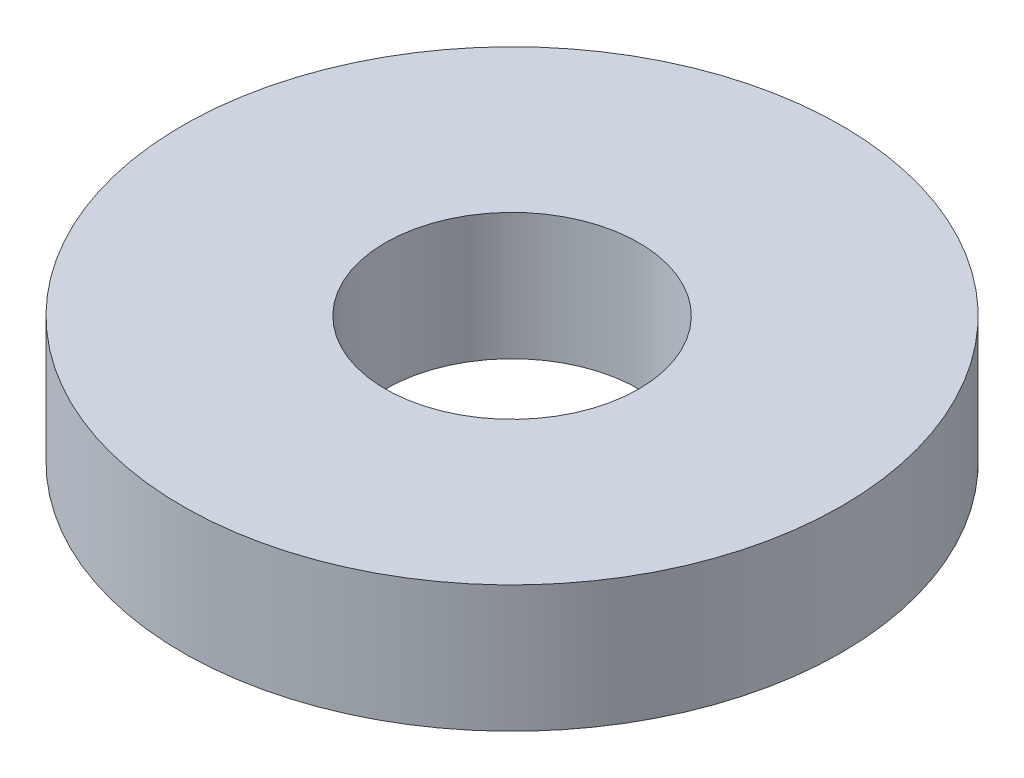
ISO-10303-21;
HEADER;
FILE_DESCRIPTION(('STEP AP214'),'2;1');
FILE_NAME('part.step','',(''),(''),'','','');
FILE_SCHEMA(('AUTOMOTIVE_DESIGN { 1 0 10303 214 1 1 1 1 }'));
ENDSEC;
DATA;
#1=APPLICATION_CONTEXT('core data for automotive mechanical design processes');
#2=APPLICATION_PROTOCOL_DEFINITION('international standard','automotive_design',2000,#1);
#3=PRODUCT_CONTEXT('',#1,'mechanical');
#4=PRODUCT('Part','Part','',(#3));
#5=PRODUCT_RELATED_PRODUCT_CATEGORY('part','',(#4));
#6=PRODUCT_DEFINITION_FORMATION('','',#4);
#7=PRODUCT_DEFINITION_CONTEXT('part definition',#1,'design');
#8=PRODUCT_DEFINITION('design','',#6,#7);
#9=PRODUCT_DEFINITION_SHAPE('','',#8);
#10=(LENGTH_UNIT() NAMED_UNIT(*) SI_UNIT(.MILLI.,.METRE.));
#11=(NAMED_UNIT(*) PLANE_ANGLE_UNIT() SI_UNIT($,.RADIAN.));
#12=(NAMED_UNIT(*) SI_UNIT($,.STERADIAN.) SOLID_ANGLE_UNIT());
#13=UNCERTAINTY_MEASURE_WITH_UNIT(LENGTH_MEASURE(1.E-05),#10,'distance_accuracy_value','');
#14=(GEOMETRIC_REPRESENTATION_CONTEXT(3) GLOBAL_UNCERTAINTY_ASSIGNED_CONTEXT((#13)) GLOBAL_UNIT_ASSIGNED_CONTEXT((#10,
#11,#12)) REPRESENTATION_CONTEXT('',''));
#15=CARTESIAN_POINT('',(0.,0.,0.));
#16=DIRECTION('',(0.,0.,1.));
#17=DIRECTION('',(1.,0.,0.));
#18=AXIS2_PLACEMENT_3D('',#15,#16,#17);
#19=CARTESIAN_POINT('',(1.29916963098693E-11,143.832558139535,-9.99599455596024E-13));
#20=DIRECTION('',(0.,1.,0.));
#21=DIRECTION('',(0.994899822224884,0.,0.100867951981266));
#22=AXIS2_PLACEMENT_3D('',#19,#20,#21);
#23=CYLINDRICAL_SURFACE('',#22,6.3);
#24=CARTESIAN_POINT('',(1.29916963098693E-11,142.582558139535,-9.99599455596024E-13));
#25=DIRECTION('',(0.,1.,0.));
#26=DIRECTION('',(0.994899822224884,0.,0.100867951981266));
#27=AXIS2_PLACEMENT_3D('',#24,#25,#26);
#28=CIRCLE('',#27,6.3);
#29=CARTESIAN_POINT('',(-6.26786888000377,142.582558139535,-0.635468097482974));
#30=VERTEX_POINT('',#29);
#31=EDGE_CURVE('E56',#30,#30,#28,.T.);
#32=ORIENTED_EDGE('',*,*,#31,.F.);
#33=DIRECTION('',(0.,1.,0.));
#34=VECTOR('',#33,1.);
#35=CARTESIAN_POINT('',(-6.26786888000377,143.832558139535,-0.635468097482974));
#36=LINE('',#35,#34);
#37=CARTESIAN_POINT('',(-6.26786888000377,144.882558139535,-0.635468097482976));
#38=VERTEX_POINT('',#37);
#39=EDGE_CURVE('E11',#30,#38,#36,.T.);
#40=ORIENTED_EDGE('',*,*,#39,.T.);
#41=CARTESIAN_POINT('',(1.29916963098693E-11,144.882558139535,-9.99599455596024E-13));
#42=DIRECTION('',(0.,1.,0.));
#43=DIRECTION('',(0.994899822224884,0.,0.100867951981266));
#44=AXIS2_PLACEMENT_3D('',#41,#42,#43);
#45=CIRCLE('',#44,6.3);
#46=EDGE_CURVE('E48',#38,#38,#45,.T.);
#47=ORIENTED_EDGE('',*,*,#46,.T.);
#48=ORIENTED_EDGE('',*,*,#39,.F.);
#49=EDGE_LOOP('',(#32,#40,#47,#48));
#50=FACE_BOUND('',#49,.T.);
#51=ADVANCED_FACE('F38',(#50),#23,.F.);
#52=CARTESIAN_POINT('',(2.4872495555752,144.882558139535,0.252169879952165));
#53=DIRECTION('',(0.,1.,0.));
#54=DIRECTION('',(-0.994899822224884,0.,-0.100867951981266));
#55=AXIS2_PLACEMENT_3D('',#52,#53,#54);
#56=PLANE('',#55);
#57=ORIENTED_EDGE('',*,*,#46,.F.);
#58=EDGE_LOOP('',(#57));
#59=FACE_BOUND('',#58,.T.);
#60=CARTESIAN_POINT('',(1.29916963098693E-11,144.882558139535,-9.99599455596024E-13));
#61=DIRECTION('',(0.,1.,0.));
#62=DIRECTION('',(0.994899822224884,0.,0.100867951981266));
#63=AXIS2_PLACEMENT_3D('',#60,#61,#62);
#64=CIRCLE('',#63,2.7);
#65=CARTESIAN_POINT('',(-2.68622951999419,144.882558139535,-0.272343470350418));
#66=VERTEX_POINT('',#65);
#67=EDGE_CURVE('E96',#66,#66,#64,.T.);
#68=ORIENTED_EDGE('',*,*,#67,.T.);
#69=EDGE_LOOP('',(#68));
#70=FACE_BOUND('',#69,.T.);
#71=ADVANCED_FACE('F40',(#59,#70),#56,.F.);
#72=CARTESIAN_POINT('',(1.29916963098693E-11,143.832558139535,-9.99599455596024E-13));
#73=DIRECTION('',(0.,1.,0.));
#74=DIRECTION('',(0.994899822224884,0.,0.100867951981266));
#75=AXIS2_PLACEMENT_3D('',#72,#73,#74);
#76=CYLINDRICAL_SURFACE('',#75,2.7);
#77=CARTESIAN_POINT('',(1.29916963098693E-11,142.582558139535,-9.99599455596024E-13));
#78=DIRECTION('',(0.,-1.,0.));
#79=DIRECTION('',(0.994899822224884,0.,0.100867951981266));
#80=AXIS2_PLACEMENT_3D('',#77,#78,#79);
#81=CIRCLE('',#80,2.7);
#82=CARTESIAN_POINT('',(-2.68622951999419,142.582558139535,-0.272343470350418));
#83=VERTEX_POINT('',#82);
#84=EDGE_CURVE('E77',#83,#83,#81,.T.);
#85=ORIENTED_EDGE('',*,*,#84,.F.);
#86=DIRECTION('',(0.,1.,0.));
#87=VECTOR('',#86,1.);
#88=CARTESIAN_POINT('',(-2.68622951999419,143.832558139535,-0.272343470350417));
#89=LINE('',#88,#87);
#90=EDGE_CURVE('E42',#83,#66,#89,.T.);
#91=ORIENTED_EDGE('',*,*,#90,.T.);
#92=ORIENTED_EDGE('',*,*,#67,.F.);
#93=ORIENTED_EDGE('',*,*,#90,.F.);
#94=EDGE_LOOP('',(#85,#91,#92,#93));
#95=FACE_BOUND('',#94,.T.);
#96=ADVANCED_FACE('F101',(#95),#76,.T.);
#97=CARTESIAN_POINT('',(6.46684884447474,142.582558139535,0.655641687877229));
#98=DIRECTION('',(0.,-1.,0.));
#99=DIRECTION('',(-0.100867951981266,0.,0.994899822224884));
#100=AXIS2_PLACEMENT_3D('',#97,#98,#99);
#101=PLANE('',#100);
#102=ORIENTED_EDGE('',*,*,#84,.T.);
#103=EDGE_LOOP('',(#102));
#104=FACE_BOUND('',#103,.T.);
#105=CARTESIAN_POINT('',(1.29916963098693E-11,142.582558139535,-9.99599455596024E-13));
#106=DIRECTION('',(0.,1.,0.));
#107=DIRECTION('',(-0.994899822224884,0.,-0.100867951981266));
#108=AXIS2_PLACEMENT_3D('',#105,#106,#107);
#109=CIRCLE('',#108,2.5);
#110=CARTESIAN_POINT('',(-2.48724955554922,142.582558139535,-0.252169879954164));
#111=VERTEX_POINT('',#110);
#112=EDGE_CURVE('E83',#111,#111,#109,.T.);
#113=ORIENTED_EDGE('',*,*,#112,.T.);
#114=EDGE_LOOP('',(#113));
#115=FACE_BOUND('',#114,.T.);
#116=ADVANCED_FACE('F103',(#104,#115),#101,.T.);
#117=CARTESIAN_POINT('',(1.29916963098693E-11,143.832558139535,-9.99599455596024E-13));
#118=DIRECTION('',(0.,1.,0.));
#119=DIRECTION('',(0.994899822224884,0.,0.100867951981266));
#120=AXIS2_PLACEMENT_3D('',#117,#118,#119);
#121=CYLINDRICAL_SURFACE('',#120,6.5);
#122=CARTESIAN_POINT('',(1.29916963098693E-11,145.082558139535,-9.99599455596024E-13));
#123=DIRECTION('',(0.,1.,0.));
#124=DIRECTION('',(-0.994899822224884,0.,-0.100867951981266));
#125=AXIS2_PLACEMENT_3D('',#122,#123,#124);
#126=CIRCLE('',#125,6.5);
#127=CARTESIAN_POINT('',(-6.46684884444875,145.082558139535,-0.655641687879228));
#128=VERTEX_POINT('',#127);
#129=EDGE_CURVE('E130',#128,#128,#126,.T.);
#130=ORIENTED_EDGE('',*,*,#129,.F.);
#131=DIRECTION('',(0.,-1.,0.));
#132=VECTOR('',#131,1.);
#133=CARTESIAN_POINT('',(-6.46684884444875,143.832558139535,-0.655641687879228));
#134=LINE('',#133,#132);
#135=CARTESIAN_POINT('',(-6.46684884444875,142.582558139535,-0.655641687879228));
#136=VERTEX_POINT('',#135);
#137=EDGE_CURVE('E88',#128,#136,#134,.T.);
#138=ORIENTED_EDGE('',*,*,#137,.T.);
#139=CARTESIAN_POINT('',(1.29916963098693E-11,142.582558139535,-9.99599455596024E-13));
#140=DIRECTION('',(0.,1.,0.));
#141=DIRECTION('',(-0.994899822224884,0.,-0.100867951981266));
#142=AXIS2_PLACEMENT_3D('',#139,#140,#141);
#143=CIRCLE('',#142,6.5);
#144=EDGE_CURVE('E92',#136,#136,#143,.T.);
#145=ORIENTED_EDGE('',*,*,#144,.T.);
#146=ORIENTED_EDGE('',*,*,#137,.F.);
#147=EDGE_LOOP('',(#130,#138,#145,#146));
#148=FACE_BOUND('',#147,.T.);
#149=ADVANCED_FACE('F109',(#148),#121,.T.);
#150=CARTESIAN_POINT('',(2.4872495555752,145.082558139535,0.252169879952165));
#151=DIRECTION('',(0.,1.,0.));
#152=DIRECTION('',(-0.994899822224884,0.,-0.100867951981266));
#153=AXIS2_PLACEMENT_3D('',#150,#151,#152);
#154=PLANE('',#153);
#155=ORIENTED_EDGE('',*,*,#129,.T.);
#156=EDGE_LOOP('',(#155));
#157=FACE_BOUND('',#156,.T.);
#158=CARTESIAN_POINT('',(1.29916963098693E-11,145.082558139535,-9.99599455596024E-13));
#159=DIRECTION('',(0.,1.,0.));
#160=DIRECTION('',(-0.994899822224884,0.,-0.100867951981266));
#161=AXIS2_PLACEMENT_3D('',#158,#159,#160);
#162=CIRCLE('',#161,2.5);
#163=CARTESIAN_POINT('',(-2.48724955554922,145.082558139535,-0.252169879954164));
#164=VERTEX_POINT('',#163);
#165=EDGE_CURVE('E132',#164,#164,#162,.T.);
#166=ORIENTED_EDGE('',*,*,#165,.F.);
#167=EDGE_LOOP('',(#166));
#168=FACE_BOUND('',#167,.T.);
#169=ADVANCED_FACE('F119',(#157,#168),#154,.T.);
#170=CARTESIAN_POINT('',(1.29916963098693E-11,143.832558139535,-9.99599455596024E-13));
#171=DIRECTION('',(0.,1.,0.));
#172=DIRECTION('',(0.994899822224884,0.,0.100867951981266));
#173=AXIS2_PLACEMENT_3D('',#170,#171,#172);
#174=CYLINDRICAL_SURFACE('',#173,2.5);
#175=ORIENTED_EDGE('',*,*,#165,.T.);
#176=DIRECTION('',(0.,-1.,0.));
#177=VECTOR('',#176,1.);
#178=CARTESIAN_POINT('',(-2.48724955554922,143.832558139535,-0.252169879954164));
#179=LINE('',#178,#177);
#180=EDGE_CURVE('E86',#164,#111,#179,.T.);
#181=ORIENTED_EDGE('',*,*,#180,.T.);
#182=ORIENTED_EDGE('',*,*,#112,.F.);
#183=ORIENTED_EDGE('',*,*,#180,.F.);
#184=EDGE_LOOP('',(#175,#181,#182,#183));
#185=FACE_BOUND('',#184,.T.);
#186=ADVANCED_FACE('F85',(#185),#174,.F.);
#187=CARTESIAN_POINT('',(6.46684884447474,142.582558139535,0.655641687877229));
#188=DIRECTION('',(0.,-1.,0.));
#189=DIRECTION('',(-0.100867951981266,0.,0.994899822224884));
#190=AXIS2_PLACEMENT_3D('',#187,#188,#189);
#191=PLANE('',#190);
#192=ORIENTED_EDGE('',*,*,#144,.F.);
#193=EDGE_LOOP('',(#192));
#194=FACE_BOUND('',#193,.T.);
#195=ORIENTED_EDGE('',*,*,#31,.T.);
#196=EDGE_LOOP('',(#195));
#197=FACE_BOUND('',#196,.T.);
#198=ADVANCED_FACE('F126',(#194,#197),#191,.T.);
#199=CLOSED_SHELL('',(#51,#71,#96,#116,#149,#169,#186,#198));
#200=MANIFOLD_SOLID_BREP('B2',#199);
#201=ADVANCED_BREP_SHAPE_REPRESENTATION('',(#18,#200),#14);
#202=SHAPE_DEFINITION_REPRESENTATION(#9,#201);
ENDSEC;
END-ISO-10303-21;
